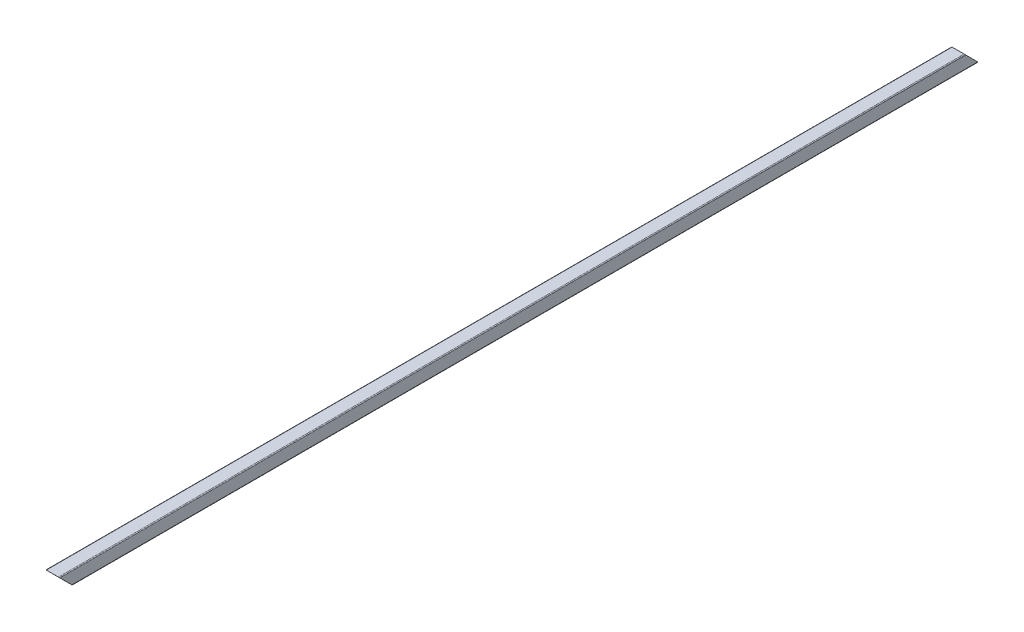
ISO-10303-21;
HEADER;
FILE_DESCRIPTION(('STEP AP214'),'2;1');
FILE_NAME('part.step','',(''),(''),'','','');
FILE_SCHEMA(('AUTOMOTIVE_DESIGN { 1 0 10303 214 1 1 1 1 }'));
ENDSEC;
DATA;
#1=APPLICATION_CONTEXT('core data for automotive mechanical design processes');
#2=APPLICATION_PROTOCOL_DEFINITION('international standard','automotive_design',2000,#1);
#3=PRODUCT_CONTEXT('',#1,'mechanical');
#4=PRODUCT('Part','Part','',(#3));
#5=PRODUCT_RELATED_PRODUCT_CATEGORY('part','',(#4));
#6=PRODUCT_DEFINITION_FORMATION('','',#4);
#7=PRODUCT_DEFINITION_CONTEXT('part definition',#1,'design');
#8=PRODUCT_DEFINITION('design','',#6,#7);
#9=PRODUCT_DEFINITION_SHAPE('','',#8);
#10=(LENGTH_UNIT() NAMED_UNIT(*) SI_UNIT(.MILLI.,.METRE.));
#11=(NAMED_UNIT(*) PLANE_ANGLE_UNIT() SI_UNIT($,.RADIAN.));
#12=(NAMED_UNIT(*) SI_UNIT($,.STERADIAN.) SOLID_ANGLE_UNIT());
#13=UNCERTAINTY_MEASURE_WITH_UNIT(LENGTH_MEASURE(1.E-05),#10,'distance_accuracy_value','');
#14=(GEOMETRIC_REPRESENTATION_CONTEXT(3) GLOBAL_UNCERTAINTY_ASSIGNED_CONTEXT((#13)) GLOBAL_UNIT_ASSIGNED_CONTEXT((#10,
#11,#12)) REPRESENTATION_CONTEXT('',''));
#15=CARTESIAN_POINT('',(0.,0.,0.));
#16=DIRECTION('',(0.,0.,1.));
#17=DIRECTION('',(1.,0.,0.));
#18=AXIS2_PLACEMENT_3D('',#15,#16,#17);
#19=CARTESIAN_POINT('',(-50.,22.,1752.07971682817));
#20=DIRECTION('',(1.,0.,0.));
#21=DIRECTION('',(0.,0.,-1.));
#22=AXIS2_PLACEMENT_3D('',#19,#20,#21);
#23=PLANE('',#22);
#24=DIRECTION('',(0.,-0.707950183965392,-0.706262371235625));
#25=VECTOR('',#24,1.);
#26=CARTESIAN_POINT('',(-50.,53.6740209564437,1720.33000188328));
#27=LINE('',#26,#25);
#28=CARTESIAN_POINT('',(-50.,22.,1688.73149445446));
#29=VERTEX_POINT('',#28);
#30=CARTESIAN_POINT('',(-50.,-22.,1644.83639415191));
#31=VERTEX_POINT('',#30);
#32=EDGE_CURVE('E11',#29,#31,#27,.T.);
#33=ORIENTED_EDGE('',*,*,#32,.F.);
#34=DIRECTION('',(0.,0.,-1.));
#35=VECTOR('',#34,1.);
#36=CARTESIAN_POINT('',(-50.,22.,1752.07971682817));
#37=LINE('',#36,#35);
#38=CARTESIAN_POINT('',(-50.,22.,-1644.83639415191));
#39=VERTEX_POINT('',#38);
#40=EDGE_CURVE('E250',#29,#39,#37,.T.);
#41=ORIENTED_EDGE('',*,*,#40,.T.);
#42=DIRECTION('',(0.,-0.707950183965392,-0.706262371235625));
#43=VECTOR('',#42,1.);
#44=CARTESIAN_POINT('',(-50.,-31.6215085854719,-1698.33006455494));
#45=LINE('',#44,#43);
#46=CARTESIAN_POINT('',(-50.,-22.,-1688.73149445446));
#47=VERTEX_POINT('',#46);
#48=EDGE_CURVE('E278',#39,#47,#45,.T.);
#49=ORIENTED_EDGE('',*,*,#48,.T.);
#50=DIRECTION('',(0.,0.,-1.));
#51=VECTOR('',#50,1.);
#52=CARTESIAN_POINT('',(-50.,-22.,1752.07971682817));
#53=LINE('',#52,#51);
#54=EDGE_CURVE('E248',#31,#47,#53,.T.);
#55=ORIENTED_EDGE('',*,*,#54,.F.);
#56=EDGE_LOOP('',(#33,#41,#49,#55));
#57=FACE_BOUND('',#56,.T.);
#58=ADVANCED_FACE('F36',(#57),#23,.F.);
#59=CARTESIAN_POINT('',(-47.,22.,1752.07971682817));
#60=DIRECTION('',(0.,0.,-1.));
#61=DIRECTION('',(-1.,0.,0.));
#62=AXIS2_PLACEMENT_3D('',#59,#60,#61);
#63=CYLINDRICAL_SURFACE('',#62,3.);
#64=CARTESIAN_POINT('',(-47.,22.,1688.73149445446));
#65=DIRECTION('',(0.,-0.706262371235625,0.707950183965392));
#66=DIRECTION('',(0.,-0.707950183965392,-0.706262371235625));
#67=AXIS2_PLACEMENT_3D('',#64,#65,#66);
#68=ELLIPSE('',#67,4.23758629907589,3.);
#69=CARTESIAN_POINT('',(-47.,25.,1691.72434220236));
#70=VERTEX_POINT('',#69);
#71=EDGE_CURVE('E223',#70,#29,#68,.T.);
#72=ORIENTED_EDGE('',*,*,#71,.F.);
#73=DIRECTION('',(0.,0.,-1.));
#74=VECTOR('',#73,1.);
#75=CARTESIAN_POINT('',(-47.,25.,1752.07971682817));
#76=LINE('',#75,#74);
#77=CARTESIAN_POINT('',(-47.,25.,-1641.84354640401));
#78=VERTEX_POINT('',#77);
#79=EDGE_CURVE('E252',#70,#78,#76,.T.);
#80=ORIENTED_EDGE('',*,*,#79,.T.);
#81=CARTESIAN_POINT('',(-47.,22.,-1644.83639415191));
#82=DIRECTION('',(0.,0.706262371235625,-0.707950183965392));
#83=DIRECTION('',(0.,0.707950183965392,0.706262371235625));
#84=AXIS2_PLACEMENT_3D('',#81,#82,#83);
#85=ELLIPSE('',#84,4.23758629907589,3.);
#86=EDGE_CURVE('E275',#78,#39,#85,.F.);
#87=ORIENTED_EDGE('',*,*,#86,.T.);
#88=ORIENTED_EDGE('',*,*,#40,.F.);
#89=EDGE_LOOP('',(#72,#80,#87,#88));
#90=FACE_BOUND('',#89,.T.);
#91=ADVANCED_FACE('F268',(#90),#63,.T.);
#92=CARTESIAN_POINT('',(-47.,25.,1752.07971682817));
#93=DIRECTION('',(0.,-1.,0.));
#94=DIRECTION('',(1.,0.,0.));
#95=AXIS2_PLACEMENT_3D('',#92,#93,#94);
#96=PLANE('',#95);
#97=DIRECTION('',(-1.,0.,0.));
#98=VECTOR('',#97,1.);
#99=CARTESIAN_POINT('',(-47.,25.,1691.72434220236));
#100=LINE('',#99,#98);
#101=CARTESIAN_POINT('',(-3.,25.0000000000008,1691.72434220236));
#102=VERTEX_POINT('',#101);
#103=EDGE_CURVE('E225',#102,#70,#100,.T.);
#104=ORIENTED_EDGE('',*,*,#103,.F.);
#105=DIRECTION('',(0.,0.,-1.));
#106=VECTOR('',#105,1.);
#107=CARTESIAN_POINT('',(-3.,25.,1752.07971682817));
#108=LINE('',#107,#106);
#109=CARTESIAN_POINT('',(-3.,25.,-1641.84354640401));
#110=VERTEX_POINT('',#109);
#111=EDGE_CURVE('E254',#102,#110,#108,.T.);
#112=ORIENTED_EDGE('',*,*,#111,.T.);
#113=DIRECTION('',(-1.,0.,0.));
#114=VECTOR('',#113,1.);
#115=CARTESIAN_POINT('',(-47.,25.,-1641.84354640401));
#116=LINE('',#115,#114);
#117=EDGE_CURVE('E274',#110,#78,#116,.T.);
#118=ORIENTED_EDGE('',*,*,#117,.T.);
#119=ORIENTED_EDGE('',*,*,#79,.F.);
#120=EDGE_LOOP('',(#104,#112,#118,#119));
#121=FACE_BOUND('',#120,.T.);
#122=ADVANCED_FACE('F273',(#121),#96,.F.);
#123=CARTESIAN_POINT('',(-3.,22.,1752.07971682817));
#124=DIRECTION('',(0.,0.,-1.));
#125=DIRECTION('',(-1.,0.,0.));
#126=AXIS2_PLACEMENT_3D('',#123,#124,#125);
#127=CYLINDRICAL_SURFACE('',#126,3.00000000000001);
#128=CARTESIAN_POINT('',(-3.,22.,1688.73149445446));
#129=DIRECTION('',(0.,-0.706262371235625,0.707950183965392));
#130=DIRECTION('',(0.,-0.707950183965392,-0.706262371235625));
#131=AXIS2_PLACEMENT_3D('',#128,#129,#130);
#132=ELLIPSE('',#131,4.2375862990759,3.00000000000001);
#133=CARTESIAN_POINT('',(0.,22.,1688.73149445446));
#134=VERTEX_POINT('',#133);
#135=EDGE_CURVE('E53',#134,#102,#132,.T.);
#136=ORIENTED_EDGE('',*,*,#135,.F.);
#137=DIRECTION('',(0.,0.,-1.));
#138=VECTOR('',#137,1.);
#139=CARTESIAN_POINT('',(0.,22.,1752.07971682817));
#140=LINE('',#139,#138);
#141=CARTESIAN_POINT('',(6.26235174827627E-13,22.0000000000007,-1644.83639415191));
#142=VERTEX_POINT('',#141);
#143=EDGE_CURVE('E156',#134,#142,#140,.T.);
#144=ORIENTED_EDGE('',*,*,#143,.T.);
#145=CARTESIAN_POINT('',(-3.,22.,-1644.83639415191));
#146=DIRECTION('',(0.,0.706262371235625,-0.707950183965392));
#147=DIRECTION('',(0.,0.707950183965392,0.706262371235625));
#148=AXIS2_PLACEMENT_3D('',#145,#146,#147);
#149=ELLIPSE('',#148,4.2375862990759,3.00000000000001);
#150=EDGE_CURVE('E168',#142,#110,#149,.F.);
#151=ORIENTED_EDGE('',*,*,#150,.T.);
#152=ORIENTED_EDGE('',*,*,#111,.F.);
#153=EDGE_LOOP('',(#136,#144,#151,#152));
#154=FACE_BOUND('',#153,.T.);
#155=ADVANCED_FACE('F305',(#154),#127,.T.);
#156=CARTESIAN_POINT('',(0.,22.,1752.07971682817));
#157=DIRECTION('',(-1.,0.,0.));
#158=DIRECTION('',(0.,0.,1.));
#159=AXIS2_PLACEMENT_3D('',#156,#157,#158);
#160=PLANE('',#159);
#161=DIRECTION('',(0.,0.707950183965392,0.706262371235625));
#162=VECTOR('',#161,1.);
#163=CARTESIAN_POINT('',(0.,53.6740209564437,1720.33000188328));
#164=LINE('',#163,#162);
#165=CARTESIAN_POINT('',(0.,-21.9999999999996,1644.83639415191));
#166=VERTEX_POINT('',#165);
#167=EDGE_CURVE('E40',#166,#134,#164,.T.);
#168=ORIENTED_EDGE('',*,*,#167,.F.);
#169=DIRECTION('',(0.,0.,-1.));
#170=VECTOR('',#169,1.);
#171=CARTESIAN_POINT('',(0.,-22.,1752.07971682817));
#172=LINE('',#171,#170);
#173=CARTESIAN_POINT('',(0.,-22.,-1688.73149445446));
#174=VERTEX_POINT('',#173);
#175=EDGE_CURVE('E147',#166,#174,#172,.T.);
#176=ORIENTED_EDGE('',*,*,#175,.T.);
#177=DIRECTION('',(0.,0.707950183965392,0.706262371235625));
#178=VECTOR('',#177,1.);
#179=CARTESIAN_POINT('',(0.,-31.6215085854719,-1698.33006455494));
#180=LINE('',#179,#178);
#181=EDGE_CURVE('E151',#174,#142,#180,.T.);
#182=ORIENTED_EDGE('',*,*,#181,.T.);
#183=ORIENTED_EDGE('',*,*,#143,.F.);
#184=EDGE_LOOP('',(#168,#176,#182,#183));
#185=FACE_BOUND('',#184,.T.);
#186=ADVANCED_FACE('F149',(#185),#160,.F.);
#187=CARTESIAN_POINT('',(-3.,-22.,1752.07971682817));
#188=DIRECTION('',(0.,0.,-1.));
#189=DIRECTION('',(-1.,0.,0.));
#190=AXIS2_PLACEMENT_3D('',#187,#188,#189);
#191=CYLINDRICAL_SURFACE('',#190,3.);
#192=CARTESIAN_POINT('',(-3.,-22.,1644.83639415191));
#193=DIRECTION('',(0.,-0.706262371235625,0.707950183965392));
#194=DIRECTION('',(0.,-0.707950183965392,-0.706262371235625));
#195=AXIS2_PLACEMENT_3D('',#192,#193,#194);
#196=ELLIPSE('',#195,4.23758629907589,3.);
#197=CARTESIAN_POINT('',(-3.,-25.,1641.84354640401));
#198=VERTEX_POINT('',#197);
#199=EDGE_CURVE('E230',#198,#166,#196,.T.);
#200=ORIENTED_EDGE('',*,*,#199,.F.);
#201=DIRECTION('',(0.,0.,-1.));
#202=VECTOR('',#201,1.);
#203=CARTESIAN_POINT('',(-2.99999999999999,-25.,1752.07971682817));
#204=LINE('',#203,#202);
#205=CARTESIAN_POINT('',(-2.99999999999999,-25.,-1691.72434220236));
#206=VERTEX_POINT('',#205);
#207=EDGE_CURVE('E155',#198,#206,#204,.T.);
#208=ORIENTED_EDGE('',*,*,#207,.T.);
#209=CARTESIAN_POINT('',(-3.,-22.,-1688.73149445446));
#210=DIRECTION('',(0.,0.706262371235625,-0.707950183965392));
#211=DIRECTION('',(0.,0.707950183965392,0.706262371235625));
#212=AXIS2_PLACEMENT_3D('',#209,#210,#211);
#213=ELLIPSE('',#212,4.23758629907589,3.);
#214=EDGE_CURVE('E164',#206,#174,#213,.F.);
#215=ORIENTED_EDGE('',*,*,#214,.T.);
#216=ORIENTED_EDGE('',*,*,#175,.F.);
#217=EDGE_LOOP('',(#200,#208,#215,#216));
#218=FACE_BOUND('',#217,.T.);
#219=ADVANCED_FACE('F170',(#218),#191,.T.);
#220=CARTESIAN_POINT('',(-47.,-25.,1752.07971682817));
#221=DIRECTION('',(0.,1.,0.));
#222=DIRECTION('',(0.,0.,1.));
#223=AXIS2_PLACEMENT_3D('',#220,#221,#222);
#224=PLANE('',#223);
#225=DIRECTION('',(1.,0.,0.));
#226=VECTOR('',#225,1.);
#227=CARTESIAN_POINT('',(-47.,-25.,1641.84354640401));
#228=LINE('',#227,#226);
#229=CARTESIAN_POINT('',(-47.,-25.,1641.84354640401));
#230=VERTEX_POINT('',#229);
#231=EDGE_CURVE('E228',#230,#198,#228,.T.);
#232=ORIENTED_EDGE('',*,*,#231,.F.);
#233=DIRECTION('',(0.,0.,-1.));
#234=VECTOR('',#233,1.);
#235=CARTESIAN_POINT('',(-47.,-25.,1752.07971682817));
#236=LINE('',#235,#234);
#237=CARTESIAN_POINT('',(-47.,-25.,-1691.72434220236));
#238=VERTEX_POINT('',#237);
#239=EDGE_CURVE('E258',#230,#238,#236,.T.);
#240=ORIENTED_EDGE('',*,*,#239,.T.);
#241=DIRECTION('',(1.,0.,0.));
#242=VECTOR('',#241,1.);
#243=CARTESIAN_POINT('',(-47.,-25.,-1691.72434220236));
#244=LINE('',#243,#242);
#245=EDGE_CURVE('E172',#238,#206,#244,.T.);
#246=ORIENTED_EDGE('',*,*,#245,.T.);
#247=ORIENTED_EDGE('',*,*,#207,.F.);
#248=EDGE_LOOP('',(#232,#240,#246,#247));
#249=FACE_BOUND('',#248,.T.);
#250=ADVANCED_FACE('F292',(#249),#224,.F.);
#251=CARTESIAN_POINT('',(-47.,-22.,1752.07971682817));
#252=DIRECTION('',(0.,0.,-1.));
#253=DIRECTION('',(-1.,0.,0.));
#254=AXIS2_PLACEMENT_3D('',#251,#252,#253);
#255=CYLINDRICAL_SURFACE('',#254,3.);
#256=CARTESIAN_POINT('',(-47.,-22.,1644.83639415191));
#257=DIRECTION('',(0.,-0.706262371235625,0.707950183965392));
#258=DIRECTION('',(0.,-0.707950183965392,-0.706262371235625));
#259=AXIS2_PLACEMENT_3D('',#256,#257,#258);
#260=ELLIPSE('',#259,4.23758629907589,3.);
#261=EDGE_CURVE('E221',#31,#230,#260,.T.);
#262=ORIENTED_EDGE('',*,*,#261,.F.);
#263=ORIENTED_EDGE('',*,*,#54,.T.);
#264=CARTESIAN_POINT('',(-47.,-22.,-1688.73149445446));
#265=DIRECTION('',(0.,0.706262371235625,-0.707950183965392));
#266=DIRECTION('',(0.,0.707950183965392,0.706262371235625));
#267=AXIS2_PLACEMENT_3D('',#264,#265,#266);
#268=ELLIPSE('',#267,4.23758629907589,3.);
#269=EDGE_CURVE('E177',#47,#238,#268,.F.);
#270=ORIENTED_EDGE('',*,*,#269,.T.);
#271=ORIENTED_EDGE('',*,*,#239,.F.);
#272=EDGE_LOOP('',(#262,#263,#270,#271));
#273=FACE_BOUND('',#272,.T.);
#274=ADVANCED_FACE('F38',(#273),#255,.T.);
#275=CARTESIAN_POINT('',(-47.,20.,1752.07971682817));
#276=DIRECTION('',(1.,0.,0.));
#277=DIRECTION('',(0.,0.,-1.));
#278=AXIS2_PLACEMENT_3D('',#275,#276,#277);
#279=PLANE('',#278);
#280=DIRECTION('',(0.,0.,-1.));
#281=VECTOR('',#280,1.);
#282=CARTESIAN_POINT('',(-47.,20.,1752.07971682817));
#283=LINE('',#282,#281);
#284=CARTESIAN_POINT('',(-47.,20.,1686.73626262252));
#285=VERTEX_POINT('',#284);
#286=CARTESIAN_POINT('',(-47.,20.,-1646.83162598384));
#287=VERTEX_POINT('',#286);
#288=EDGE_CURVE('E234',#285,#287,#283,.T.);
#289=ORIENTED_EDGE('',*,*,#288,.F.);
#290=DIRECTION('',(0.,-0.707950183965392,-0.706262371235625));
#291=VECTOR('',#290,1.);
#292=CARTESIAN_POINT('',(-47.,52.6716340304904,1719.33000473199));
#293=LINE('',#292,#291);
#294=CARTESIAN_POINT('',(-47.,-20.,1646.83162598384));
#295=VERTEX_POINT('',#294);
#296=EDGE_CURVE('E226',#285,#295,#293,.T.);
#297=ORIENTED_EDGE('',*,*,#296,.T.);
#298=DIRECTION('',(0.,0.,-1.));
#299=VECTOR('',#298,1.);
#300=CARTESIAN_POINT('',(-47.,-20.,1752.07971682817));
#301=LINE('',#300,#299);
#302=CARTESIAN_POINT('',(-47.,-20.,-1686.73626262252));
#303=VERTEX_POINT('',#302);
#304=EDGE_CURVE('E186',#295,#303,#301,.T.);
#305=ORIENTED_EDGE('',*,*,#304,.T.);
#306=DIRECTION('',(0.,-0.707950183965392,-0.706262371235625));
#307=VECTOR('',#306,1.);
#308=CARTESIAN_POINT('',(-47.,-32.6238955114252,-1699.33006170623));
#309=LINE('',#308,#307);
#310=EDGE_CURVE('E183',#287,#303,#309,.T.);
#311=ORIENTED_EDGE('',*,*,#310,.F.);
#312=EDGE_LOOP('',(#289,#297,#305,#311));
#313=FACE_BOUND('',#312,.T.);
#314=ADVANCED_FACE('F316',(#313),#279,.T.);
#315=CARTESIAN_POINT('',(-45.,20.,1752.07971682817));
#316=DIRECTION('',(0.,0.,-1.));
#317=DIRECTION('',(-1.,0.,0.));
#318=AXIS2_PLACEMENT_3D('',#315,#316,#317);
#319=CYLINDRICAL_SURFACE('',#318,2.);
#320=DIRECTION('',(0.,0.,-1.));
#321=VECTOR('',#320,1.);
#322=CARTESIAN_POINT('',(-45.,22.,1752.07971682817));
#323=LINE('',#322,#321);
#324=CARTESIAN_POINT('',(-45.,22.,1688.73149445446));
#325=VERTEX_POINT('',#324);
#326=CARTESIAN_POINT('',(-45.,22.,-1644.83639415191));
#327=VERTEX_POINT('',#326);
#328=EDGE_CURVE('E236',#325,#327,#323,.T.);
#329=ORIENTED_EDGE('',*,*,#328,.F.);
#330=CARTESIAN_POINT('',(-45.,20.,1686.73626262252));
#331=DIRECTION('',(0.,-0.706262371235625,0.707950183965392));
#332=DIRECTION('',(0.,-0.707950183965392,-0.706262371235625));
#333=AXIS2_PLACEMENT_3D('',#330,#331,#332);
#334=ELLIPSE('',#333,2.82505753271726,2.);
#335=EDGE_CURVE('E46',#325,#285,#334,.T.);
#336=ORIENTED_EDGE('',*,*,#335,.T.);
#337=ORIENTED_EDGE('',*,*,#288,.T.);
#338=CARTESIAN_POINT('',(-45.,20.,-1646.83162598384));
#339=DIRECTION('',(0.,0.706262371235625,-0.707950183965392));
#340=DIRECTION('',(0.,0.707950183965392,0.706262371235625));
#341=AXIS2_PLACEMENT_3D('',#338,#339,#340);
#342=ELLIPSE('',#341,2.82505753271726,2.);
#343=EDGE_CURVE('E187',#327,#287,#342,.F.);
#344=ORIENTED_EDGE('',*,*,#343,.F.);
#345=EDGE_LOOP('',(#329,#336,#337,#344));
#346=FACE_BOUND('',#345,.T.);
#347=ADVANCED_FACE('F320',(#346),#319,.F.);
#348=CARTESIAN_POINT('',(-45.,22.,1752.07971682817));
#349=DIRECTION('',(0.,-1.,0.));
#350=DIRECTION('',(0.,0.,-1.));
#351=AXIS2_PLACEMENT_3D('',#348,#349,#350);
#352=PLANE('',#351);
#353=DIRECTION('',(0.,0.,-1.));
#354=VECTOR('',#353,1.);
#355=CARTESIAN_POINT('',(-5.,22.,1752.07971682817));
#356=LINE('',#355,#354);
#357=CARTESIAN_POINT('',(-5.,22.,1688.73149445446));
#358=VERTEX_POINT('',#357);
#359=CARTESIAN_POINT('',(-5.,22.,-1644.83639415191));
#360=VERTEX_POINT('',#359);
#361=EDGE_CURVE('E238',#358,#360,#356,.T.);
#362=ORIENTED_EDGE('',*,*,#361,.F.);
#363=DIRECTION('',(-1.,0.,0.));
#364=VECTOR('',#363,1.);
#365=CARTESIAN_POINT('',(-45.,22.,1688.73149445446));
#366=LINE('',#365,#364);
#367=EDGE_CURVE('E204',#358,#325,#366,.T.);
#368=ORIENTED_EDGE('',*,*,#367,.T.);
#369=ORIENTED_EDGE('',*,*,#328,.T.);
#370=DIRECTION('',(-1.,0.,0.));
#371=VECTOR('',#370,1.);
#372=CARTESIAN_POINT('',(-45.,22.,-1644.83639415191));
#373=LINE('',#372,#371);
#374=EDGE_CURVE('E190',#360,#327,#373,.T.);
#375=ORIENTED_EDGE('',*,*,#374,.F.);
#376=EDGE_LOOP('',(#362,#368,#369,#375));
#377=FACE_BOUND('',#376,.T.);
#378=ADVANCED_FACE('F326',(#377),#352,.T.);
#379=CARTESIAN_POINT('',(-5.,20.,1752.07971682817));
#380=DIRECTION('',(0.,0.,-1.));
#381=DIRECTION('',(-1.,0.,0.));
#382=AXIS2_PLACEMENT_3D('',#379,#380,#381);
#383=CYLINDRICAL_SURFACE('',#382,2.);
#384=DIRECTION('',(0.,0.,-1.));
#385=VECTOR('',#384,1.);
#386=CARTESIAN_POINT('',(-3.,20.,1752.07971682817));
#387=LINE('',#386,#385);
#388=CARTESIAN_POINT('',(-3.,20.,1686.73626262252));
#389=VERTEX_POINT('',#388);
#390=CARTESIAN_POINT('',(-3.,20.,-1646.83162598384));
#391=VERTEX_POINT('',#390);
#392=EDGE_CURVE('E240',#389,#391,#387,.T.);
#393=ORIENTED_EDGE('',*,*,#392,.F.);
#394=CARTESIAN_POINT('',(-5.,20.,1686.73626262252));
#395=DIRECTION('',(0.,-0.706262371235625,0.707950183965392));
#396=DIRECTION('',(0.,-0.707950183965392,-0.706262371235625));
#397=AXIS2_PLACEMENT_3D('',#394,#395,#396);
#398=ELLIPSE('',#397,2.82505753271726,2.);
#399=EDGE_CURVE('E207',#389,#358,#398,.T.);
#400=ORIENTED_EDGE('',*,*,#399,.T.);
#401=ORIENTED_EDGE('',*,*,#361,.T.);
#402=CARTESIAN_POINT('',(-5.,20.,-1646.83162598384));
#403=DIRECTION('',(0.,0.706262371235625,-0.707950183965392));
#404=DIRECTION('',(0.,0.707950183965392,0.706262371235625));
#405=AXIS2_PLACEMENT_3D('',#402,#403,#404);
#406=ELLIPSE('',#405,2.82505753271726,2.);
#407=EDGE_CURVE('E193',#391,#360,#406,.F.);
#408=ORIENTED_EDGE('',*,*,#407,.F.);
#409=EDGE_LOOP('',(#393,#400,#401,#408));
#410=FACE_BOUND('',#409,.T.);
#411=ADVANCED_FACE('F335',(#410),#383,.F.);
#412=CARTESIAN_POINT('',(-3.,20.,1752.07971682817));
#413=DIRECTION('',(-1.,0.,0.));
#414=DIRECTION('',(0.,0.,1.));
#415=AXIS2_PLACEMENT_3D('',#412,#413,#414);
#416=PLANE('',#415);
#417=DIRECTION('',(0.,0.,-1.));
#418=VECTOR('',#417,1.);
#419=CARTESIAN_POINT('',(-3.,-20.,1752.07971682817));
#420=LINE('',#419,#418);
#421=CARTESIAN_POINT('',(-3.,-20.,1646.83162598384));
#422=VERTEX_POINT('',#421);
#423=CARTESIAN_POINT('',(-3.,-20.,-1686.73626262252));
#424=VERTEX_POINT('',#423);
#425=EDGE_CURVE('E242',#422,#424,#420,.T.);
#426=ORIENTED_EDGE('',*,*,#425,.F.);
#427=DIRECTION('',(0.,0.707950183965392,0.706262371235625));
#428=VECTOR('',#427,1.);
#429=CARTESIAN_POINT('',(-3.,52.6716340304904,1719.33000473199));
#430=LINE('',#429,#428);
#431=EDGE_CURVE('E210',#422,#389,#430,.T.);
#432=ORIENTED_EDGE('',*,*,#431,.T.);
#433=ORIENTED_EDGE('',*,*,#392,.T.);
#434=DIRECTION('',(0.,0.707950183965392,0.706262371235625));
#435=VECTOR('',#434,1.);
#436=CARTESIAN_POINT('',(-3.,-32.6238955114252,-1699.33006170623));
#437=LINE('',#436,#435);
#438=EDGE_CURVE('E196',#424,#391,#437,.T.);
#439=ORIENTED_EDGE('',*,*,#438,.F.);
#440=EDGE_LOOP('',(#426,#432,#433,#439));
#441=FACE_BOUND('',#440,.T.);
#442=ADVANCED_FACE('F339',(#441),#416,.T.);
#443=CARTESIAN_POINT('',(-5.,-20.,1752.07971682817));
#444=DIRECTION('',(0.,0.,-1.));
#445=DIRECTION('',(-1.,0.,0.));
#446=AXIS2_PLACEMENT_3D('',#443,#444,#445);
#447=CYLINDRICAL_SURFACE('',#446,2.);
#448=DIRECTION('',(0.,0.,-1.));
#449=VECTOR('',#448,1.);
#450=CARTESIAN_POINT('',(-5.,-22.,1752.07971682817));
#451=LINE('',#450,#449);
#452=CARTESIAN_POINT('',(-5.,-22.,1644.83639415191));
#453=VERTEX_POINT('',#452);
#454=CARTESIAN_POINT('',(-5.,-22.,-1688.73149445446));
#455=VERTEX_POINT('',#454);
#456=EDGE_CURVE('E244',#453,#455,#451,.T.);
#457=ORIENTED_EDGE('',*,*,#456,.F.);
#458=CARTESIAN_POINT('',(-5.,-20.,1646.83162598384));
#459=DIRECTION('',(0.,-0.706262371235625,0.707950183965392));
#460=DIRECTION('',(0.,-0.707950183965392,-0.706262371235625));
#461=AXIS2_PLACEMENT_3D('',#458,#459,#460);
#462=ELLIPSE('',#461,2.82505753271726,2.);
#463=EDGE_CURVE('E213',#453,#422,#462,.T.);
#464=ORIENTED_EDGE('',*,*,#463,.T.);
#465=ORIENTED_EDGE('',*,*,#425,.T.);
#466=CARTESIAN_POINT('',(-5.,-20.,-1686.73626262252));
#467=DIRECTION('',(0.,0.706262371235625,-0.707950183965392));
#468=DIRECTION('',(0.,0.707950183965392,0.706262371235625));
#469=AXIS2_PLACEMENT_3D('',#466,#467,#468);
#470=ELLIPSE('',#469,2.82505753271726,2.);
#471=EDGE_CURVE('E199',#455,#424,#470,.F.);
#472=ORIENTED_EDGE('',*,*,#471,.F.);
#473=EDGE_LOOP('',(#457,#464,#465,#472));
#474=FACE_BOUND('',#473,.T.);
#475=ADVANCED_FACE('F343',(#474),#447,.F.);
#476=CARTESIAN_POINT('',(-45.,-22.,1752.07971682817));
#477=DIRECTION('',(0.,1.,0.));
#478=DIRECTION('',(0.,0.,1.));
#479=AXIS2_PLACEMENT_3D('',#476,#477,#478);
#480=PLANE('',#479);
#481=DIRECTION('',(0.,0.,-1.));
#482=VECTOR('',#481,1.);
#483=CARTESIAN_POINT('',(-45.,-22.,1752.07971682817));
#484=LINE('',#483,#482);
#485=CARTESIAN_POINT('',(-45.,-22.,1644.83639415191));
#486=VERTEX_POINT('',#485);
#487=CARTESIAN_POINT('',(-45.,-22.,-1688.73149445446));
#488=VERTEX_POINT('',#487);
#489=EDGE_CURVE('E246',#486,#488,#484,.T.);
#490=ORIENTED_EDGE('',*,*,#489,.F.);
#491=DIRECTION('',(1.,0.,0.));
#492=VECTOR('',#491,1.);
#493=CARTESIAN_POINT('',(-45.,-22.,1644.83639415191));
#494=LINE('',#493,#492);
#495=EDGE_CURVE('E216',#486,#453,#494,.T.);
#496=ORIENTED_EDGE('',*,*,#495,.T.);
#497=ORIENTED_EDGE('',*,*,#456,.T.);
#498=DIRECTION('',(1.,0.,0.));
#499=VECTOR('',#498,1.);
#500=CARTESIAN_POINT('',(-45.,-22.,-1688.73149445446));
#501=LINE('',#500,#499);
#502=EDGE_CURVE('E182',#488,#455,#501,.T.);
#503=ORIENTED_EDGE('',*,*,#502,.F.);
#504=EDGE_LOOP('',(#490,#496,#497,#503));
#505=FACE_BOUND('',#504,.T.);
#506=ADVANCED_FACE('F346',(#505),#480,.T.);
#507=CARTESIAN_POINT('',(-45.,-20.,1752.07971682817));
#508=DIRECTION('',(0.,0.,-1.));
#509=DIRECTION('',(-1.,0.,0.));
#510=AXIS2_PLACEMENT_3D('',#507,#508,#509);
#511=CYLINDRICAL_SURFACE('',#510,2.);
#512=ORIENTED_EDGE('',*,*,#304,.F.);
#513=CARTESIAN_POINT('',(-45.,-20.,1646.83162598384));
#514=DIRECTION('',(0.,-0.706262371235625,0.707950183965392));
#515=DIRECTION('',(0.,-0.707950183965392,-0.706262371235625));
#516=AXIS2_PLACEMENT_3D('',#513,#514,#515);
#517=ELLIPSE('',#516,2.82505753271726,2.);
#518=EDGE_CURVE('E219',#295,#486,#517,.T.);
#519=ORIENTED_EDGE('',*,*,#518,.T.);
#520=ORIENTED_EDGE('',*,*,#489,.T.);
#521=CARTESIAN_POINT('',(-45.,-20.,-1686.73626262252));
#522=DIRECTION('',(0.,0.706262371235625,-0.707950183965392));
#523=DIRECTION('',(0.,0.707950183965392,0.706262371235625));
#524=AXIS2_PLACEMENT_3D('',#521,#522,#523);
#525=ELLIPSE('',#524,2.82505753271726,2.);
#526=EDGE_CURVE('E174',#303,#488,#525,.F.);
#527=ORIENTED_EDGE('',*,*,#526,.F.);
#528=EDGE_LOOP('',(#512,#519,#520,#527));
#529=FACE_BOUND('',#528,.T.);
#530=ADVANCED_FACE('F300',(#529),#511,.F.);
#531=CARTESIAN_POINT('',(0.,-1791.89847128091,-120.842490443552));
#532=DIRECTION('',(0.,-0.706262371235625,0.707950183965392));
#533=DIRECTION('',(0.,0.707950183965392,0.706262371235625));
#534=AXIS2_PLACEMENT_3D('',#531,#532,#533);
#535=PLANE('',#534);
#536=ORIENTED_EDGE('',*,*,#296,.F.);
#537=ORIENTED_EDGE('',*,*,#335,.F.);
#538=ORIENTED_EDGE('',*,*,#367,.F.);
#539=ORIENTED_EDGE('',*,*,#399,.F.);
#540=ORIENTED_EDGE('',*,*,#431,.F.);
#541=ORIENTED_EDGE('',*,*,#463,.F.);
#542=ORIENTED_EDGE('',*,*,#495,.F.);
#543=ORIENTED_EDGE('',*,*,#518,.F.);
#544=EDGE_LOOP('',(#536,#537,#538,#539,#540,#541,#542,#543));
#545=FACE_BOUND('',#544,.T.);
#546=ORIENTED_EDGE('',*,*,#135,.T.);
#547=ORIENTED_EDGE('',*,*,#103,.T.);
#548=ORIENTED_EDGE('',*,*,#71,.T.);
#549=ORIENTED_EDGE('',*,*,#32,.T.);
#550=ORIENTED_EDGE('',*,*,#261,.T.);
#551=ORIENTED_EDGE('',*,*,#231,.T.);
#552=ORIENTED_EDGE('',*,*,#199,.T.);
#553=ORIENTED_EDGE('',*,*,#167,.T.);
#554=EDGE_LOOP('',(#546,#547,#548,#549,#550,#551,#552,#553));
#555=FACE_BOUND('',#554,.T.);
#556=ADVANCED_FACE('F262',(#545,#555),#535,.T.);
#557=CARTESIAN_POINT('',(6.26235174827627E-13,-1883.36923290916,-3545.66306669587));
#558=DIRECTION('',(0.,0.706262371235625,-0.707950183965392));
#559=DIRECTION('',(-1.,0.,0.));
#560=AXIS2_PLACEMENT_3D('',#557,#558,#559);
#561=PLANE('',#560);
#562=ORIENTED_EDGE('',*,*,#181,.F.);
#563=ORIENTED_EDGE('',*,*,#214,.F.);
#564=ORIENTED_EDGE('',*,*,#245,.F.);
#565=ORIENTED_EDGE('',*,*,#269,.F.);
#566=ORIENTED_EDGE('',*,*,#48,.F.);
#567=ORIENTED_EDGE('',*,*,#86,.F.);
#568=ORIENTED_EDGE('',*,*,#117,.F.);
#569=ORIENTED_EDGE('',*,*,#150,.F.);
#570=EDGE_LOOP('',(#562,#563,#564,#565,#566,#567,#568,#569));
#571=FACE_BOUND('',#570,.T.);
#572=ORIENTED_EDGE('',*,*,#526,.T.);
#573=ORIENTED_EDGE('',*,*,#502,.T.);
#574=ORIENTED_EDGE('',*,*,#471,.T.);
#575=ORIENTED_EDGE('',*,*,#438,.T.);
#576=ORIENTED_EDGE('',*,*,#407,.T.);
#577=ORIENTED_EDGE('',*,*,#374,.T.);
#578=ORIENTED_EDGE('',*,*,#343,.T.);
#579=ORIENTED_EDGE('',*,*,#310,.T.);
#580=EDGE_LOOP('',(#572,#573,#574,#575,#576,#577,#578,#579));
#581=FACE_BOUND('',#580,.T.);
#582=ADVANCED_FACE('F161',(#571,#581),#561,.T.);
#583=CLOSED_SHELL('',(#58,#91,#122,#155,#186,#219,#250,#274,#314,#347,#378,#411,#442,#475,#506,
#530,#556,#582));
#584=MANIFOLD_SOLID_BREP('B2',#583);
#585=ADVANCED_BREP_SHAPE_REPRESENTATION('',(#18,#584),#14);
#586=SHAPE_DEFINITION_REPRESENTATION(#9,#585);
ENDSEC;
END-ISO-10303-21;
